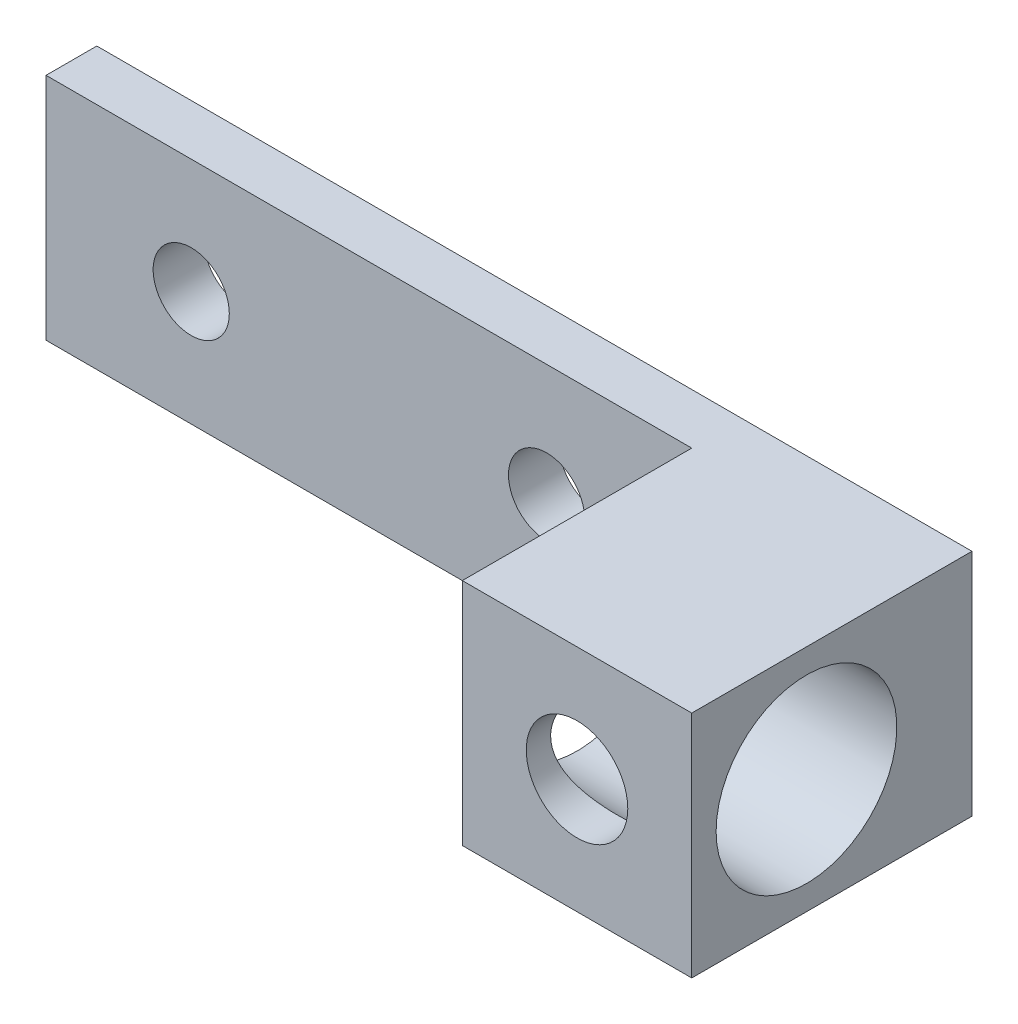
ISO-10303-21;
HEADER;
FILE_DESCRIPTION(('STEP AP214'),'2;1');
FILE_NAME('part.step','',(''),(''),'','','');
FILE_SCHEMA(('AUTOMOTIVE_DESIGN { 1 0 10303 214 1 1 1 1 }'));
ENDSEC;
DATA;
#1=APPLICATION_CONTEXT('core data for automotive mechanical design processes');
#2=APPLICATION_PROTOCOL_DEFINITION('international standard','automotive_design',2000,#1);
#3=PRODUCT_CONTEXT('',#1,'mechanical');
#4=PRODUCT('Part','Part','',(#3));
#5=PRODUCT_RELATED_PRODUCT_CATEGORY('part','',(#4));
#6=PRODUCT_DEFINITION_FORMATION('','',#4);
#7=PRODUCT_DEFINITION_CONTEXT('part definition',#1,'design');
#8=PRODUCT_DEFINITION('design','',#6,#7);
#9=PRODUCT_DEFINITION_SHAPE('','',#8);
#10=(LENGTH_UNIT() NAMED_UNIT(*) SI_UNIT(.MILLI.,.METRE.));
#11=(NAMED_UNIT(*) PLANE_ANGLE_UNIT() SI_UNIT($,.RADIAN.));
#12=(NAMED_UNIT(*) SI_UNIT($,.STERADIAN.) SOLID_ANGLE_UNIT());
#13=UNCERTAINTY_MEASURE_WITH_UNIT(LENGTH_MEASURE(1.E-05),#10,'distance_accuracy_value','');
#14=(GEOMETRIC_REPRESENTATION_CONTEXT(3) GLOBAL_UNCERTAINTY_ASSIGNED_CONTEXT((#13)) GLOBAL_UNIT_ASSIGNED_CONTEXT((#10,
#11,#12)) REPRESENTATION_CONTEXT('',''));
#15=CARTESIAN_POINT('',(0.,0.,0.));
#16=DIRECTION('',(0.,0.,1.));
#17=DIRECTION('',(1.,0.,0.));
#18=AXIS2_PLACEMENT_3D('',#15,#16,#17);
#19=CARTESIAN_POINT('',(-109.474,28.702,0.));
#20=DIRECTION('',(0.,0.,1.));
#21=DIRECTION('',(1.,0.,0.));
#22=AXIS2_PLACEMENT_3D('',#19,#20,#21);
#23=PLANE('',#22);
#24=CARTESIAN_POINT('',(-46.863,14.351,0.));
#25=DIRECTION('',(0.,0.,1.));
#26=DIRECTION('',(-1.,0.,0.));
#27=AXIS2_PLACEMENT_3D('',#24,#25,#26);
#28=CIRCLE('',#27,4.7625);
#29=CARTESIAN_POINT('',(-51.6255,14.351,0.));
#30=VERTEX_POINT('',#29);
#31=EDGE_CURVE('E168',#30,#30,#28,.T.);
#32=ORIENTED_EDGE('',*,*,#31,.T.);
#33=EDGE_LOOP('',(#32));
#34=FACE_BOUND('',#33,.T.);
#35=CARTESIAN_POINT('',(-91.313,14.351,0.));
#36=DIRECTION('',(0.,0.,1.));
#37=DIRECTION('',(1.,0.,0.));
#38=AXIS2_PLACEMENT_3D('',#35,#36,#37);
#39=CIRCLE('',#38,4.7625);
#40=CARTESIAN_POINT('',(-86.5505,14.351,0.));
#41=VERTEX_POINT('',#40);
#42=EDGE_CURVE('E171',#41,#41,#39,.T.);
#43=ORIENTED_EDGE('',*,*,#42,.T.);
#44=EDGE_LOOP('',(#43));
#45=FACE_BOUND('',#44,.T.);
#46=DIRECTION('',(-1.,0.,0.));
#47=VECTOR('',#46,1.);
#48=CARTESIAN_POINT('',(-109.474,0.,0.));
#49=LINE('',#48,#47);
#50=CARTESIAN_POINT('',(0.,0.,0.));
#51=VERTEX_POINT('',#50);
#52=CARTESIAN_POINT('',(-109.474,0.,0.));
#53=VERTEX_POINT('',#52);
#54=EDGE_CURVE('E121',#51,#53,#49,.T.);
#55=ORIENTED_EDGE('',*,*,#54,.T.);
#56=DIRECTION('',(0.,-1.,0.));
#57=VECTOR('',#56,1.);
#58=CARTESIAN_POINT('',(-109.474,28.702,0.));
#59=LINE('',#58,#57);
#60=CARTESIAN_POINT('',(-109.474,28.702,0.));
#61=VERTEX_POINT('',#60);
#62=EDGE_CURVE('E11',#61,#53,#59,.T.);
#63=ORIENTED_EDGE('',*,*,#62,.F.);
#64=DIRECTION('',(-1.,0.,0.));
#65=VECTOR('',#64,1.);
#66=CARTESIAN_POINT('',(-109.474,28.702,0.));
#67=LINE('',#66,#65);
#68=CARTESIAN_POINT('',(0.,28.702,0.));
#69=VERTEX_POINT('',#68);
#70=EDGE_CURVE('E132',#69,#61,#67,.T.);
#71=ORIENTED_EDGE('',*,*,#70,.F.);
#72=DIRECTION('',(0.,-1.,0.));
#73=VECTOR('',#72,1.);
#74=CARTESIAN_POINT('',(0.,28.702,0.));
#75=LINE('',#74,#73);
#76=EDGE_CURVE('E117',#69,#51,#75,.T.);
#77=ORIENTED_EDGE('',*,*,#76,.T.);
#78=EDGE_LOOP('',(#55,#63,#71,#77));
#79=FACE_BOUND('',#78,.T.);
#80=ADVANCED_FACE('F32',(#34,#45,#79),#23,.F.);
#81=CARTESIAN_POINT('',(-109.474,28.702,6.35));
#82=DIRECTION('',(1.,0.,0.));
#83=DIRECTION('',(0.,0.,-1.));
#84=AXIS2_PLACEMENT_3D('',#81,#82,#83);
#85=PLANE('',#84);
#86=DIRECTION('',(0.,0.,1.));
#87=VECTOR('',#86,1.);
#88=CARTESIAN_POINT('',(-109.474,0.,6.35));
#89=LINE('',#88,#87);
#90=CARTESIAN_POINT('',(-109.474,0.,6.35));
#91=VERTEX_POINT('',#90);
#92=EDGE_CURVE('E124',#53,#91,#89,.T.);
#93=ORIENTED_EDGE('',*,*,#92,.T.);
#94=DIRECTION('',(0.,-1.,0.));
#95=VECTOR('',#94,1.);
#96=CARTESIAN_POINT('',(-109.474,28.702,6.35));
#97=LINE('',#96,#95);
#98=CARTESIAN_POINT('',(-109.474,28.702,6.35));
#99=VERTEX_POINT('',#98);
#100=EDGE_CURVE('E45',#99,#91,#97,.T.);
#101=ORIENTED_EDGE('',*,*,#100,.F.);
#102=DIRECTION('',(0.,0.,1.));
#103=VECTOR('',#102,1.);
#104=CARTESIAN_POINT('',(-109.474,28.702,6.35));
#105=LINE('',#104,#103);
#106=EDGE_CURVE('E90',#61,#99,#105,.T.);
#107=ORIENTED_EDGE('',*,*,#106,.F.);
#108=ORIENTED_EDGE('',*,*,#62,.T.);
#109=EDGE_LOOP('',(#93,#101,#107,#108));
#110=FACE_BOUND('',#109,.T.);
#111=ADVANCED_FACE('F160',(#110),#85,.F.);
#112=CARTESIAN_POINT('',(-28.702,28.702,6.34999999999999));
#113=DIRECTION('',(0.,0.,-1.));
#114=DIRECTION('',(-1.,0.,0.));
#115=AXIS2_PLACEMENT_3D('',#112,#113,#114);
#116=PLANE('',#115);
#117=CARTESIAN_POINT('',(-46.863,14.351,6.34999999999999));
#118=DIRECTION('',(0.,0.,1.));
#119=DIRECTION('',(-1.,0.,0.));
#120=AXIS2_PLACEMENT_3D('',#117,#118,#119);
#121=CIRCLE('',#120,4.7625);
#122=CARTESIAN_POINT('',(-51.6255,14.351,6.34999999999999));
#123=VERTEX_POINT('',#122);
#124=EDGE_CURVE('E181',#123,#123,#121,.T.);
#125=ORIENTED_EDGE('',*,*,#124,.F.);
#126=EDGE_LOOP('',(#125));
#127=FACE_BOUND('',#126,.T.);
#128=CARTESIAN_POINT('',(-91.313,14.351,6.34999999999999));
#129=DIRECTION('',(0.,0.,1.));
#130=DIRECTION('',(1.,0.,0.));
#131=AXIS2_PLACEMENT_3D('',#128,#129,#130);
#132=CIRCLE('',#131,4.7625);
#133=CARTESIAN_POINT('',(-86.5505,14.351,6.34999999999999));
#134=VERTEX_POINT('',#133);
#135=EDGE_CURVE('E174',#134,#134,#132,.T.);
#136=ORIENTED_EDGE('',*,*,#135,.F.);
#137=EDGE_LOOP('',(#136));
#138=FACE_BOUND('',#137,.T.);
#139=DIRECTION('',(1.,0.,0.));
#140=VECTOR('',#139,1.);
#141=CARTESIAN_POINT('',(-28.702,0.,6.34999999999999));
#142=LINE('',#141,#140);
#143=CARTESIAN_POINT('',(-28.702,0.,6.34999999999999));
#144=VERTEX_POINT('',#143);
#145=EDGE_CURVE('E127',#91,#144,#142,.T.);
#146=ORIENTED_EDGE('',*,*,#145,.T.);
#147=DIRECTION('',(0.,-1.,0.));
#148=VECTOR('',#147,1.);
#149=CARTESIAN_POINT('',(-28.702,28.702,6.34999999999999));
#150=LINE('',#149,#148);
#151=CARTESIAN_POINT('',(-28.702,28.702,6.34999999999999));
#152=VERTEX_POINT('',#151);
#153=EDGE_CURVE('E112',#152,#144,#150,.T.);
#154=ORIENTED_EDGE('',*,*,#153,.F.);
#155=DIRECTION('',(1.,0.,0.));
#156=VECTOR('',#155,1.);
#157=CARTESIAN_POINT('',(-28.702,28.702,6.34999999999999));
#158=LINE('',#157,#156);
#159=EDGE_CURVE('E103',#99,#152,#158,.T.);
#160=ORIENTED_EDGE('',*,*,#159,.F.);
#161=ORIENTED_EDGE('',*,*,#100,.T.);
#162=EDGE_LOOP('',(#146,#154,#160,#161));
#163=FACE_BOUND('',#162,.T.);
#164=ADVANCED_FACE('F139',(#127,#138,#163),#116,.F.);
#165=CARTESIAN_POINT('',(-28.702,28.702,35.052));
#166=DIRECTION('',(1.,0.,0.));
#167=DIRECTION('',(0.,0.,-1.));
#168=AXIS2_PLACEMENT_3D('',#165,#166,#167);
#169=PLANE('',#168);
#170=CARTESIAN_POINT('',(-28.702,14.351,20.701));
#171=DIRECTION('',(-1.,0.,0.));
#172=DIRECTION('',(0.,0.,1.));
#173=AXIS2_PLACEMENT_3D('',#170,#171,#172);
#174=CIRCLE('',#173,11.303);
#175=CARTESIAN_POINT('',(-28.702,14.351,32.004));
#176=VERTEX_POINT('',#175);
#177=EDGE_CURVE('E185',#176,#176,#174,.T.);
#178=ORIENTED_EDGE('',*,*,#177,.F.);
#179=EDGE_LOOP('',(#178));
#180=FACE_BOUND('',#179,.T.);
#181=DIRECTION('',(0.,0.,1.));
#182=VECTOR('',#181,1.);
#183=CARTESIAN_POINT('',(-28.702,0.,35.052));
#184=LINE('',#183,#182);
#185=CARTESIAN_POINT('',(-28.702,0.,35.052));
#186=VERTEX_POINT('',#185);
#187=EDGE_CURVE('E111',#144,#186,#184,.T.);
#188=ORIENTED_EDGE('',*,*,#187,.T.);
#189=DIRECTION('',(0.,-1.,0.));
#190=VECTOR('',#189,1.);
#191=CARTESIAN_POINT('',(-28.702,28.702,35.052));
#192=LINE('',#191,#190);
#193=CARTESIAN_POINT('',(-28.702,28.702,35.052));
#194=VERTEX_POINT('',#193);
#195=EDGE_CURVE('E108',#194,#186,#192,.T.);
#196=ORIENTED_EDGE('',*,*,#195,.F.);
#197=DIRECTION('',(0.,0.,1.));
#198=VECTOR('',#197,1.);
#199=CARTESIAN_POINT('',(-28.702,28.702,35.052));
#200=LINE('',#199,#198);
#201=EDGE_CURVE('E97',#152,#194,#200,.T.);
#202=ORIENTED_EDGE('',*,*,#201,.F.);
#203=ORIENTED_EDGE('',*,*,#153,.T.);
#204=EDGE_LOOP('',(#188,#196,#202,#203));
#205=FACE_BOUND('',#204,.T.);
#206=ADVANCED_FACE('F109',(#180,#205),#169,.F.);
#207=CARTESIAN_POINT('',(0.,28.702,35.052));
#208=DIRECTION('',(0.,0.,-1.));
#209=DIRECTION('',(-1.,0.,0.));
#210=AXIS2_PLACEMENT_3D('',#207,#208,#209);
#211=PLANE('',#210);
#212=CARTESIAN_POINT('',(-14.351,14.351,35.052));
#213=DIRECTION('',(0.,0.,1.));
#214=DIRECTION('',(1.,0.,0.));
#215=AXIS2_PLACEMENT_3D('',#212,#213,#214);
#216=CIRCLE('',#215,6.35);
#217=CARTESIAN_POINT('',(-8.001,14.351,35.052));
#218=VERTEX_POINT('',#217);
#219=EDGE_CURVE('E173',#218,#218,#216,.T.);
#220=ORIENTED_EDGE('',*,*,#219,.F.);
#221=EDGE_LOOP('',(#220));
#222=FACE_BOUND('',#221,.T.);
#223=DIRECTION('',(1.,0.,0.));
#224=VECTOR('',#223,1.);
#225=CARTESIAN_POINT('',(0.,0.,35.052));
#226=LINE('',#225,#224);
#227=CARTESIAN_POINT('',(0.,0.,35.052));
#228=VERTEX_POINT('',#227);
#229=EDGE_CURVE('E76',#186,#228,#226,.T.);
#230=ORIENTED_EDGE('',*,*,#229,.T.);
#231=DIRECTION('',(0.,-1.,0.));
#232=VECTOR('',#231,1.);
#233=CARTESIAN_POINT('',(0.,28.702,35.052));
#234=LINE('',#233,#232);
#235=CARTESIAN_POINT('',(0.,28.702,35.052));
#236=VERTEX_POINT('',#235);
#237=EDGE_CURVE('E113',#236,#228,#234,.T.);
#238=ORIENTED_EDGE('',*,*,#237,.F.);
#239=DIRECTION('',(1.,0.,0.));
#240=VECTOR('',#239,1.);
#241=CARTESIAN_POINT('',(0.,28.702,35.052));
#242=LINE('',#241,#240);
#243=EDGE_CURVE('E101',#194,#236,#242,.T.);
#244=ORIENTED_EDGE('',*,*,#243,.F.);
#245=ORIENTED_EDGE('',*,*,#195,.T.);
#246=EDGE_LOOP('',(#230,#238,#244,#245));
#247=FACE_BOUND('',#246,.T.);
#248=ADVANCED_FACE('F115',(#222,#247),#211,.F.);
#249=CARTESIAN_POINT('',(0.,28.702,0.));
#250=DIRECTION('',(-1.,0.,0.));
#251=DIRECTION('',(0.,0.,1.));
#252=AXIS2_PLACEMENT_3D('',#249,#250,#251);
#253=PLANE('',#252);
#254=CARTESIAN_POINT('',(0.,14.351,20.701));
#255=DIRECTION('',(-1.,0.,0.));
#256=DIRECTION('',(0.,0.,1.));
#257=AXIS2_PLACEMENT_3D('',#254,#255,#256);
#258=CIRCLE('',#257,11.303);
#259=CARTESIAN_POINT('',(0.,14.351,32.004));
#260=VERTEX_POINT('',#259);
#261=EDGE_CURVE('E125',#260,#260,#258,.T.);
#262=ORIENTED_EDGE('',*,*,#261,.T.);
#263=EDGE_LOOP('',(#262));
#264=FACE_BOUND('',#263,.T.);
#265=DIRECTION('',(0.,0.,-1.));
#266=VECTOR('',#265,1.);
#267=CARTESIAN_POINT('',(0.,0.,0.));
#268=LINE('',#267,#266);
#269=EDGE_CURVE('E82',#228,#51,#268,.T.);
#270=ORIENTED_EDGE('',*,*,#269,.T.);
#271=ORIENTED_EDGE('',*,*,#76,.F.);
#272=DIRECTION('',(0.,0.,-1.));
#273=VECTOR('',#272,1.);
#274=CARTESIAN_POINT('',(0.,28.702,0.));
#275=LINE('',#274,#273);
#276=EDGE_CURVE('E53',#236,#69,#275,.T.);
#277=ORIENTED_EDGE('',*,*,#276,.F.);
#278=ORIENTED_EDGE('',*,*,#237,.T.);
#279=EDGE_LOOP('',(#270,#271,#277,#278));
#280=FACE_BOUND('',#279,.T.);
#281=ADVANCED_FACE('F146',(#264,#280),#253,.F.);
#282=CARTESIAN_POINT('',(0.,28.702,0.));
#283=DIRECTION('',(0.,-1.,0.));
#284=DIRECTION('',(0.,0.,-1.));
#285=AXIS2_PLACEMENT_3D('',#282,#283,#284);
#286=PLANE('',#285);
#287=ORIENTED_EDGE('',*,*,#70,.T.);
#288=ORIENTED_EDGE('',*,*,#106,.T.);
#289=ORIENTED_EDGE('',*,*,#159,.T.);
#290=ORIENTED_EDGE('',*,*,#201,.T.);
#291=ORIENTED_EDGE('',*,*,#243,.T.);
#292=ORIENTED_EDGE('',*,*,#276,.T.);
#293=EDGE_LOOP('',(#287,#288,#289,#290,#291,#292));
#294=FACE_BOUND('',#293,.T.);
#295=ADVANCED_FACE('F99',(#294),#286,.F.);
#296=CARTESIAN_POINT('',(0.,0.,0.));
#297=DIRECTION('',(0.,-1.,0.));
#298=DIRECTION('',(0.,0.,-1.));
#299=AXIS2_PLACEMENT_3D('',#296,#297,#298);
#300=PLANE('',#299);
#301=ORIENTED_EDGE('',*,*,#54,.F.);
#302=ORIENTED_EDGE('',*,*,#269,.F.);
#303=ORIENTED_EDGE('',*,*,#229,.F.);
#304=ORIENTED_EDGE('',*,*,#187,.F.);
#305=ORIENTED_EDGE('',*,*,#145,.F.);
#306=ORIENTED_EDGE('',*,*,#92,.F.);
#307=EDGE_LOOP('',(#301,#302,#303,#304,#305,#306));
#308=FACE_BOUND('',#307,.T.);
#309=ADVANCED_FACE('F142',(#308),#300,.T.);
#310=CARTESIAN_POINT('',(0.,14.351,20.701));
#311=DIRECTION('',(-1.,0.,0.));
#312=DIRECTION('',(0.,0.,1.));
#313=AXIS2_PLACEMENT_3D('',#310,#311,#312);
#314=CYLINDRICAL_SURFACE('',#313,11.303);
#315=CARTESIAN_POINT('',(-8.001,14.351,32.004));
#316=CARTESIAN_POINT('',(-8.00099912831532,14.5155149028601,32.0040007690748));
#317=CARTESIAN_POINT('',(-8.00739998338768,14.6800189496199,32.0004008598081));
#318=CARTESIAN_POINT('',(-8.03291359702306,15.0077279814215,31.9860968983464));
#319=CARTESIAN_POINT('',(-8.05202626451994,15.1709329757612,31.9753928970445));
#320=CARTESIAN_POINT('',(-8.10271199592684,15.4947937982238,31.9471535698381));
#321=CARTESIAN_POINT('',(-8.13428541951069,15.655449552625,31.929618046745));
#322=CARTESIAN_POINT('',(-8.20949773856698,15.9730631311584,31.8881522838086));
#323=CARTESIAN_POINT('',(-8.25313701378968,16.1300208387328,31.8642218426978));
#324=CARTESIAN_POINT('',(-8.35178991506302,16.4386086441443,31.8106408578678));
#325=CARTESIAN_POINT('',(-8.40675779392988,16.5902573850842,31.7810133513193));
#326=CARTESIAN_POINT('',(-8.52761688348378,16.8880376524935,31.7166478006401));
#327=CARTESIAN_POINT('',(-8.59351195462383,17.0341672066159,31.6819079508665));
#328=CARTESIAN_POINT('',(-8.80668256727048,17.4630501459463,31.5711392146248));
#329=CARTESIAN_POINT('',(-8.96951886748773,17.7365306022651,31.4885189931231));
#330=CARTESIAN_POINT('',(-9.34480660011088,18.2720916106066,31.3061174041177));
#331=CARTESIAN_POINT('',(-9.55994704365392,18.5320083005744,31.2055367194421));
#332=CARTESIAN_POINT('',(-9.9105722790378,18.8933953149301,31.0519273117179));
#333=CARTESIAN_POINT('',(-10.0322132683308,19.0091945719849,31.0002233735186));
#334=CARTESIAN_POINT('',(-10.2843885989133,19.2308921413386,30.8970477357478));
#335=CARTESIAN_POINT('',(-10.4149244847076,19.3367887265312,30.8455760781722));
#336=CARTESIAN_POINT('',(-10.6984271813441,19.5486648191525,30.7388085650285));
#337=CARTESIAN_POINT('',(-10.8523129561561,19.6534984728971,30.6836745674143));
#338=CARTESIAN_POINT('',(-11.1695907539723,19.8497196787459,30.5769488098858));
#339=CARTESIAN_POINT('',(-11.3329819338572,19.9411084208696,30.525356736689));
#340=CARTESIAN_POINT('',(-11.6683226880246,20.1095510704591,30.4275809326435));
#341=CARTESIAN_POINT('',(-11.8402628089371,20.186620384241,30.3813914092385));
#342=CARTESIAN_POINT('',(-12.191854181821,20.3256375594307,30.2962160598073));
#343=CARTESIAN_POINT('',(-12.371502996195,20.3875901601217,30.2572279769712));
#344=CARTESIAN_POINT('',(-12.6979644188803,20.4838952211337,30.1956263995301));
#345=CARTESIAN_POINT('',(-12.8435535810828,20.5213174828906,30.1712944161505));
#346=CARTESIAN_POINT('',(-13.1378855153027,20.5858648363788,30.1289247495336));
#347=CARTESIAN_POINT('',(-13.2866276327639,20.6129920436899,30.110885773178));
#348=CARTESIAN_POINT('',(-13.5862137610137,20.6565924024227,30.0817251052803));
#349=CARTESIAN_POINT('',(-13.7370559058778,20.6730744632758,30.0705976294731));
#350=CARTESIAN_POINT('',(-14.0399018493206,20.6951916339317,30.055636377879));
#351=CARTESIAN_POINT('',(-14.1919056717549,20.7008265203799,30.0518027522801));
#352=CARTESIAN_POINT('',(-14.4961116994167,20.7011657835085,30.0515723704586));
#353=CARTESIAN_POINT('',(-14.6483139259811,20.695857179431,30.0551844460471));
#354=CARTESIAN_POINT('',(-14.9515914145533,20.674361558792,30.0697285219291));
#355=CARTESIAN_POINT('',(-15.1026666725197,20.6581745032376,30.0806605484602));
#356=CARTESIAN_POINT('',(-15.4026711081866,20.6151409750015,30.1094543954153));
#357=CARTESIAN_POINT('',(-15.5515994664299,20.5882905382713,30.1273187928502));
#358=CARTESIAN_POINT('',(-15.8463593735414,20.5242616629987,30.1693743791883));
#359=CARTESIAN_POINT('',(-15.9921896494822,20.4870790643059,30.193568116312));
#360=CARTESIAN_POINT('',(-16.2796367080746,20.4028797414766,30.2474679981929));
#361=CARTESIAN_POINT('',(-16.421260608921,20.3558808565261,30.2771641325169));
#362=CARTESIAN_POINT('',(-16.6999459135421,20.2524457693205,30.3412513052991));
#363=CARTESIAN_POINT('',(-16.8370057979517,20.1960064612669,30.375643888153));
#364=CARTESIAN_POINT('',(-17.2404763308142,20.0132061758388,30.4845248839774));
#365=CARTESIAN_POINT('',(-17.4993196101586,19.8733207908463,30.5647446285643));
#366=CARTESIAN_POINT('',(-18.0317880760507,19.5364034268918,30.7464642486933));
#367=CARTESIAN_POINT('',(-18.3014705957106,19.3338712923177,30.8493344310819));
#368=CARTESIAN_POINT('',(-18.6792707610271,19.000393189275,31.0042068768333));
#369=CARTESIAN_POINT('',(-18.8008291542144,18.8841914968076,31.0559635371297));
#370=CARTESIAN_POINT('',(-19.0345856897957,18.6422480481798,31.1585447862358));
#371=CARTESIAN_POINT('',(-19.1467822774718,18.5165047140303,31.2093692191411));
#372=CARTESIAN_POINT('',(-19.3726177472691,18.2421062752246,31.3142423798431));
#373=CARTESIAN_POINT('',(-19.4851360874241,18.0924375530673,31.3680574951712));
#374=CARTESIAN_POINT('',(-19.6970387998025,17.7828416373758,31.4716499770727));
#375=CARTESIAN_POINT('',(-19.7964285560272,17.6229186892938,31.5214289955851));
#376=CARTESIAN_POINT('',(-19.981166838431,17.2936759612369,31.615566963308));
#377=CARTESIAN_POINT('',(-20.0665186544419,17.1243583953927,31.659927181801));
#378=CARTESIAN_POINT('',(-20.2222202539821,16.77739943273,31.741930875302));
#379=CARTESIAN_POINT('',(-20.2925718792785,16.5997590610807,31.7795751748173));
#380=CARTESIAN_POINT('',(-20.4129389172267,16.2502415942883,31.8446095393479));
#381=CARTESIAN_POINT('',(-20.4640359025016,16.0788365586382,31.8725342554659));
#382=CARTESIAN_POINT('',(-20.5517555771375,15.7313042677437,31.9207742503867));
#383=CARTESIAN_POINT('',(-20.5883788195126,15.555177193194,31.941089819919));
#384=CARTESIAN_POINT('',(-20.6465821003577,15.1998426841524,31.9734921170293));
#385=CARTESIAN_POINT('',(-20.668173702062,15.0206377263394,31.9855851696902));
#386=CARTESIAN_POINT('',(-20.6960120311736,14.6606745114167,32.0011925255529));
#387=CARTESIAN_POINT('',(-20.7022603469979,14.4799164170403,32.0047077167795));
#388=CARTESIAN_POINT('',(-20.6994897977889,14.1396921953731,32.0031518775642));
#389=CARTESIAN_POINT('',(-20.6921685770924,13.980204624529,31.9990355820033));
#390=CARTESIAN_POINT('',(-20.6655758243142,13.6624872774031,31.9841314018549));
#391=CARTESIAN_POINT('',(-20.6463003427507,13.5042579343235,31.9733413123641));
#392=CARTESIAN_POINT('',(-20.5960440730359,13.1903153701994,31.9453519188759));
#393=CARTESIAN_POINT('',(-20.5650678430979,13.0346011939322,31.9281551107538));
#394=CARTESIAN_POINT('',(-20.491759774979,12.7266107256334,31.8877468581906));
#395=CARTESIAN_POINT('',(-20.4494235546061,12.5743357849381,31.8645330927861));
#396=CARTESIAN_POINT('',(-20.3541693813739,12.2752040214413,31.8127848071008));
#397=CARTESIAN_POINT('',(-20.3013233169824,12.1283180095415,31.7842865184745));
#398=CARTESIAN_POINT('',(-20.1853771102153,11.8396735560395,31.722473153752));
#399=CARTESIAN_POINT('',(-20.1222733989479,11.6979169201381,31.6891564016385));
#400=CARTESIAN_POINT('',(-19.9183964364786,11.281466623885,31.5829881065044));
#401=CARTESIAN_POINT('',(-19.7629908987628,11.0153863050672,31.5038814176545));
#402=CARTESIAN_POINT('',(-19.3994762479464,10.4845551962819,31.3261927139909));
#403=CARTESIAN_POINT('',(-19.1875753655863,10.2227969845333,31.2264421584672));
#404=CARTESIAN_POINT('',(-18.8417135286002,9.85832429510194,31.073615280837));
#405=CARTESIAN_POINT('',(-18.7216402750916,9.74143744430486,31.0220929166977));
#406=CARTESIAN_POINT('',(-18.4725707710316,9.51745122821655,30.9191106815303));
#407=CARTESIAN_POINT('',(-18.3435729866759,9.4103535527088,30.8676508227987));
#408=CARTESIAN_POINT('',(-18.0631737577094,9.19574677205456,30.7606733812411));
#409=CARTESIAN_POINT('',(-17.9108429343093,9.08937899689537,30.7052982377543));
#410=CARTESIAN_POINT('',(-17.5966126026124,8.88994526725565,30.5978439672693));
#411=CARTESIAN_POINT('',(-17.4347138728485,8.79687823260529,30.5457645728109));
#412=CARTESIAN_POINT('',(-17.1022625928668,8.62491566619123,30.4467480883406));
#413=CARTESIAN_POINT('',(-16.9317190673717,8.54600573059218,30.3998057908906));
#414=CARTESIAN_POINT('',(-16.5827959885346,8.40313509168115,30.3128528500038));
#415=CARTESIAN_POINT('',(-16.404418832686,8.33916985188328,30.2728401040475));
#416=CARTESIAN_POINT('',(-16.0793529257158,8.23889510998605,30.2090349621176));
#417=CARTESIAN_POINT('',(-15.9339019170189,8.19959832096307,30.1836012182953));
#418=CARTESIAN_POINT('',(-15.6396766473449,8.13130485809093,30.1389484421842));
#419=CARTESIAN_POINT('',(-15.4909030781623,8.10230606094822,30.1197281288515));
#420=CARTESIAN_POINT('',(-15.191073151982,8.05498612473419,30.0881630185705));
#421=CARTESIAN_POINT('',(-15.0400188825237,8.03665576444287,30.0758122843401));
#422=CARTESIAN_POINT('',(-14.7365573503115,8.01088707929128,30.0584046182944));
#423=CARTESIAN_POINT('',(-14.5841500629527,8.00344895291724,30.0533478193945));
#424=CARTESIAN_POINT('',(-14.2788966307253,7.99957218985348,30.0507154888353));
#425=CARTESIAN_POINT('',(-14.1260501712004,8.00315041003814,30.0531514223193));
#426=CARTESIAN_POINT('',(-13.8213140842364,8.02128969489344,30.0654377731856));
#427=CARTESIAN_POINT('',(-13.6694244602241,8.03585079887618,30.0752882171074));
#428=CARTESIAN_POINT('',(-13.3676514752421,8.07575493153789,30.1020468833444));
#429=CARTESIAN_POINT('',(-13.2177688372728,8.10110174333223,30.1189575820232));
#430=CARTESIAN_POINT('',(-12.9209891035357,8.16225724756833,30.1592561764005));
#431=CARTESIAN_POINT('',(-12.7740932360755,8.19807015469265,30.1826466813103));
#432=CARTESIAN_POINT('',(-12.4854660452439,8.2793806227773,30.2349162227374));
#433=CARTESIAN_POINT('',(-12.3437004289767,8.32478929888466,30.2637446416852));
#434=CARTESIAN_POINT('',(-12.0646125718246,8.42504554317513,30.3261938624188));
#435=CARTESIAN_POINT('',(-11.9272918082141,8.47989621196118,30.3598162378404));
#436=CARTESIAN_POINT('',(-11.5228814025691,8.65793692082251,30.4665519838407));
#437=CARTESIAN_POINT('',(-11.2631983271554,8.79465713690777,30.5455618059618));
#438=CARTESIAN_POINT('',(-10.7292593880645,9.12429947914464,30.7249529122186));
#439=CARTESIAN_POINT('',(-10.4588048403634,9.32260928787341,30.8267565257855));
#440=CARTESIAN_POINT('',(-10.0793065865173,9.64960804436822,30.9805586416906));
#441=CARTESIAN_POINT('',(-9.95709204371035,9.76362332909959,31.0320465076454));
#442=CARTESIAN_POINT('',(-9.72182667473178,10.0011509166506,31.1342794340078));
#443=CARTESIAN_POINT('',(-9.60877738285331,10.1246648028514,31.1850243688862));
#444=CARTESIAN_POINT('',(-9.38029757980737,10.3950713181609,31.290229581975));
#445=CARTESIAN_POINT('',(-9.26602552075255,10.5430316792515,31.3444670788527));
#446=CARTESIAN_POINT('',(-9.05046044256271,10.8493104488657,31.4491232735415));
#447=CARTESIAN_POINT('',(-8.94916223175596,11.0076246755879,31.4995434955666));
#448=CARTESIAN_POINT('',(-8.76043226443942,11.3337919197348,31.5951791264843));
#449=CARTESIAN_POINT('',(-8.67299851020115,11.5016435581716,31.6403952849722));
#450=CARTESIAN_POINT('',(-8.51296309213508,11.8458387580519,31.7243089286931));
#451=CARTESIAN_POINT('',(-8.4403598851383,12.0221814336121,31.7630070920721));
#452=CARTESIAN_POINT('',(-8.31445469308769,12.3722823653947,31.8308037077632));
#453=CARTESIAN_POINT('',(-8.26031919873851,12.5456617029784,31.8603090976249));
#454=CARTESIAN_POINT('',(-8.16690841131203,12.8975098609967,31.9115651359345));
#455=CARTESIAN_POINT('',(-8.12763267223182,13.0759785285064,31.9333160171262));
#456=CARTESIAN_POINT('',(-8.06456470216526,13.4363095473402,31.9683817095718));
#457=CARTESIAN_POINT('',(-8.04076038121949,13.6181691342668,31.9817031077315));
#458=CARTESIAN_POINT('',(-8.00897930470505,13.9836904443411,31.9995113838254));
#459=CARTESIAN_POINT('',(-8.00100097306174,14.1673519862053,32.0039991414817));
#460=CARTESIAN_POINT('',(-8.001,14.351,32.004));
#461=B_SPLINE_CURVE_WITH_KNOTS('',3,(#315,#316,#317,#318,#319,#320,#321,#322,#323,#324,#325,
#326,#327,#328,#329,#330,#331,#332,#333,#334,#335,#336,#337,#338,#339,#340,#341,#342,#343,#344,
#345,#346,#347,#348,#349,#350,#351,#352,#353,#354,#355,#356,#357,#358,#359,#360,#361,#362,#363,
#364,#365,#366,#367,#368,#369,#370,#371,#372,#373,#374,#375,#376,#377,#378,#379,#380,#381,#382,
#383,#384,#385,#386,#387,#388,#389,#390,#391,#392,#393,#394,#395,#396,#397,#398,#399,#400,#401,
#402,#403,#404,#405,#406,#407,#408,#409,#410,#411,#412,#413,#414,#415,#416,#417,#418,#419,#420,
#421,#422,#423,#424,#425,#426,#427,#428,#429,#430,#431,#432,#433,#434,#435,#436,#437,#438,#439,
#440,#441,#442,#443,#444,#445,#446,#447,#448,#449,#450,#451,#452,#453,#454,#455,#456,#457,#458,
#459,#460),.UNSPECIFIED.,.T.,.F.,(4,2,2,2,2,2,2,2,2,2,2,2,2,2,2,2,2,2,2,2,2,2,2,2,2,2,2,2,2,2,2,
2,2,2,2,2,2,2,2,2,2,2,2,2,2,2,2,2,2,2,2,2,2,2,2,2,2,2,2,2,2,2,2,2,2,2,2,2,2,2,2,2,4),(0.,
0.493363358061185,0.986723181755043,1.48009724708841,1.97348684222215,2.46492175488476,
2.95653065726407,3.93901209391642,4.99077621911464,5.51754041750007,6.04439631715195,
6.62626328519738,7.20807872072556,7.78926450782969,8.37026785095302,8.8266311957212,
9.28290070936622,9.73878785271519,10.1946843831558,10.6511219920995,11.1075612371137,
11.564170319762,12.0209635189319,12.4769336980798,12.9330541826767,13.8448481245487,
14.8981809987323,15.4256179164676,15.9531422522083,16.5368851413504,17.120387890725,
17.7037536990927,18.2870478388029,18.8293575642417,19.3716465670521,19.9135179464947,
20.4553332262149,20.933877091565,21.4125791438456,21.891094902104,22.3697955170359,
22.8453279055399,23.3210260991771,24.2717699991044,25.3209942886926,25.8465284475537,
26.3721531521897,26.9530583224691,27.5339162898702,28.1141798823086,28.694267105307,
29.1521896598971,29.6100177427382,30.0674495137846,30.5248896203826,30.9830300354541,
31.4411720903996,31.899474972505,32.3579626674795,32.8123762765048,33.2669393935255,
34.1756092309574,35.2226318423936,35.7469035720464,36.2712628860622,36.8545115255007,
37.4375260355008,38.0204564625001,38.6033262026688,39.1545704742492,39.7057981993899,
40.2565946544918,40.807336254261),.UNSPECIFIED.);
#462=CARTESIAN_POINT('',(-8.001,14.351,32.004));
#463=VERTEX_POINT('',#462);
#464=EDGE_CURVE('E35',#463,#463,#461,.T.);
#465=ORIENTED_EDGE('',*,*,#464,.T.);
#466=EDGE_LOOP('',(#465));
#467=FACE_BOUND('',#466,.T.);
#468=ORIENTED_EDGE('',*,*,#261,.F.);
#469=EDGE_LOOP('',(#468));
#470=FACE_BOUND('',#469,.T.);
#471=ORIENTED_EDGE('',*,*,#177,.T.);
#472=EDGE_LOOP('',(#471));
#473=FACE_BOUND('',#472,.T.);
#474=ADVANCED_FACE('F194',(#467,#470,#473),#314,.F.);
#475=CARTESIAN_POINT('',(-14.351,14.351,22.352));
#476=DIRECTION('',(0.,0.,1.));
#477=DIRECTION('',(1.,0.,0.));
#478=AXIS2_PLACEMENT_3D('',#475,#476,#477);
#479=CYLINDRICAL_SURFACE('',#478,6.35);
#480=ORIENTED_EDGE('',*,*,#219,.T.);
#481=EDGE_LOOP('',(#480));
#482=FACE_BOUND('',#481,.T.);
#483=ORIENTED_EDGE('',*,*,#464,.F.);
#484=EDGE_LOOP('',(#483));
#485=FACE_BOUND('',#484,.T.);
#486=ADVANCED_FACE('F197',(#482,#485),#479,.F.);
#487=CARTESIAN_POINT('',(-91.313,14.351,0.));
#488=DIRECTION('',(0.,0.,1.));
#489=DIRECTION('',(1.,0.,0.));
#490=AXIS2_PLACEMENT_3D('',#487,#488,#489);
#491=CYLINDRICAL_SURFACE('',#490,4.7625);
#492=ORIENTED_EDGE('',*,*,#42,.F.);
#493=EDGE_LOOP('',(#492));
#494=FACE_BOUND('',#493,.T.);
#495=ORIENTED_EDGE('',*,*,#135,.T.);
#496=EDGE_LOOP('',(#495));
#497=FACE_BOUND('',#496,.T.);
#498=ADVANCED_FACE('F199',(#494,#497),#491,.F.);
#499=CARTESIAN_POINT('',(-46.863,14.351,0.));
#500=DIRECTION('',(0.,0.,1.));
#501=DIRECTION('',(1.,0.,0.));
#502=AXIS2_PLACEMENT_3D('',#499,#500,#501);
#503=CYLINDRICAL_SURFACE('',#502,4.7625);
#504=ORIENTED_EDGE('',*,*,#31,.F.);
#505=EDGE_LOOP('',(#504));
#506=FACE_BOUND('',#505,.T.);
#507=ORIENTED_EDGE('',*,*,#124,.T.);
#508=EDGE_LOOP('',(#507));
#509=FACE_BOUND('',#508,.T.);
#510=ADVANCED_FACE('F205',(#506,#509),#503,.F.);
#511=CLOSED_SHELL('',(#80,#111,#164,#206,#248,#281,#295,#309,#474,#486,#498,#510));
#512=MANIFOLD_SOLID_BREP('B2',#511);
#513=ADVANCED_BREP_SHAPE_REPRESENTATION('',(#18,#512),#14);
#514=SHAPE_DEFINITION_REPRESENTATION(#9,#513);
ENDSEC;
END-ISO-10303-21;
